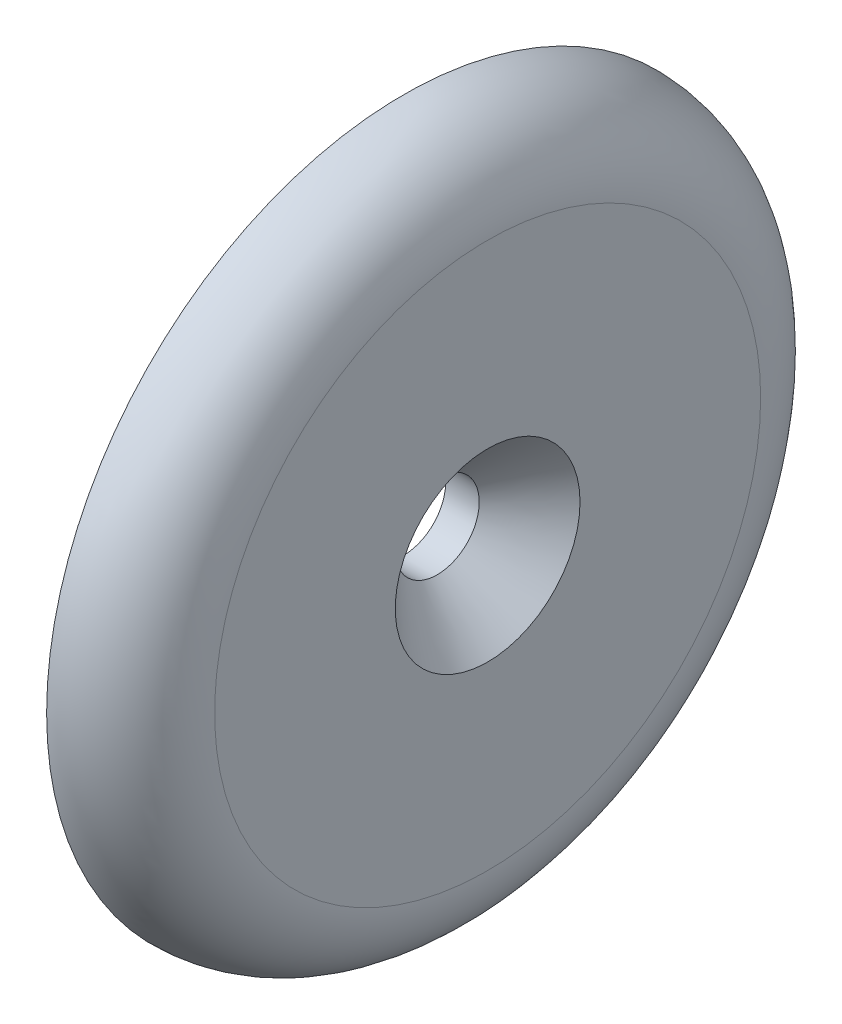
ISO-10303-21;
HEADER;
FILE_DESCRIPTION(('STEP AP214'),'2;1');
FILE_NAME('part.step','',(''),(''),'','','');
FILE_SCHEMA(('AUTOMOTIVE_DESIGN { 1 0 10303 214 1 1 1 1 }'));
ENDSEC;
DATA;
#1=APPLICATION_CONTEXT('core data for automotive mechanical design processes');
#2=APPLICATION_PROTOCOL_DEFINITION('international standard','automotive_design',2000,#1);
#3=PRODUCT_CONTEXT('',#1,'mechanical');
#4=PRODUCT('Part','Part','',(#3));
#5=PRODUCT_RELATED_PRODUCT_CATEGORY('part','',(#4));
#6=PRODUCT_DEFINITION_FORMATION('','',#4);
#7=PRODUCT_DEFINITION_CONTEXT('part definition',#1,'design');
#8=PRODUCT_DEFINITION('design','',#6,#7);
#9=PRODUCT_DEFINITION_SHAPE('','',#8);
#10=(LENGTH_UNIT() NAMED_UNIT(*) SI_UNIT(.MILLI.,.METRE.));
#11=(NAMED_UNIT(*) PLANE_ANGLE_UNIT() SI_UNIT($,.RADIAN.));
#12=(NAMED_UNIT(*) SI_UNIT($,.STERADIAN.) SOLID_ANGLE_UNIT());
#13=UNCERTAINTY_MEASURE_WITH_UNIT(LENGTH_MEASURE(1.E-05),#10,'distance_accuracy_value','');
#14=(GEOMETRIC_REPRESENTATION_CONTEXT(3) GLOBAL_UNCERTAINTY_ASSIGNED_CONTEXT((#13)) GLOBAL_UNIT_ASSIGNED_CONTEXT((#10,
#11,#12)) REPRESENTATION_CONTEXT('',''));
#15=CARTESIAN_POINT('',(0.,0.,0.));
#16=DIRECTION('',(0.,0.,1.));
#17=DIRECTION('',(1.,0.,0.));
#18=AXIS2_PLACEMENT_3D('',#15,#16,#17);
#19=CARTESIAN_POINT('',(9.99999999998398E-05,0.,0.));
#20=DIRECTION('',(1.,0.,0.));
#21=DIRECTION('',(0.,0.,-1.));
#22=AXIS2_PLACEMENT_3D('',#19,#20,#21);
#23=TOROIDAL_SURFACE('',#22,6.5001,1.9999);
#24=CARTESIAN_POINT('',(2.,0.,0.));
#25=DIRECTION('',(1.,0.,0.));
#26=DIRECTION('',(0.,0.,-1.));
#27=AXIS2_PLACEMENT_3D('',#24,#25,#26);
#28=CIRCLE('',#27,6.50009999999999);
#29=CARTESIAN_POINT('',(2.,0.,-6.50009999999999));
#30=VERTEX_POINT('',#29);
#31=EDGE_CURVE('E57',#30,#30,#28,.T.);
#32=ORIENTED_EDGE('',*,*,#31,.F.);
#33=EDGE_LOOP('',(#32));
#34=FACE_BOUND('',#33,.T.);
#35=CARTESIAN_POINT('',(9.99999999855283E-05,0.,0.));
#36=DIRECTION('',(1.,0.,0.));
#37=DIRECTION('',(0.,0.,-1.));
#38=AXIS2_PLACEMENT_3D('',#35,#36,#37);
#39=CIRCLE('',#38,8.5);
#40=CARTESIAN_POINT('',(9.99999999855283E-05,0.,-8.5));
#41=VERTEX_POINT('',#40);
#42=EDGE_CURVE('E10',#41,#41,#39,.T.);
#43=ORIENTED_EDGE('',*,*,#42,.T.);
#44=EDGE_LOOP('',(#43));
#45=FACE_BOUND('',#44,.T.);
#46=ADVANCED_FACE('F35',(#34,#45),#23,.T.);
#47=CARTESIAN_POINT('',(2.,0.,0.));
#48=DIRECTION('',(1.,0.,0.));
#49=DIRECTION('',(0.,0.,-1.));
#50=AXIS2_PLACEMENT_3D('',#47,#48,#49);
#51=CYLINDRICAL_SURFACE('',#50,8.5);
#52=ORIENTED_EDGE('',*,*,#42,.F.);
#53=EDGE_LOOP('',(#52));
#54=FACE_BOUND('',#53,.T.);
#55=CARTESIAN_POINT('',(0.,0.,0.));
#56=DIRECTION('',(1.,0.,0.));
#57=DIRECTION('',(0.,0.,-1.));
#58=AXIS2_PLACEMENT_3D('',#55,#56,#57);
#59=CIRCLE('',#58,8.5);
#60=CARTESIAN_POINT('',(0.,0.,-8.5));
#61=VERTEX_POINT('',#60);
#62=EDGE_CURVE('E41',#61,#61,#59,.T.);
#63=ORIENTED_EDGE('',*,*,#62,.T.);
#64=EDGE_LOOP('',(#63));
#65=FACE_BOUND('',#64,.T.);
#66=ADVANCED_FACE('F64',(#54,#65),#51,.T.);
#67=CARTESIAN_POINT('',(0.,0.,0.));
#68=DIRECTION('',(1.,0.,0.));
#69=DIRECTION('',(0.,0.,-1.));
#70=AXIS2_PLACEMENT_3D('',#67,#68,#69);
#71=PLANE('',#70);
#72=ORIENTED_EDGE('',*,*,#62,.F.);
#73=EDGE_LOOP('',(#72));
#74=FACE_BOUND('',#73,.T.);
#75=CARTESIAN_POINT('',(0.,0.,0.));
#76=DIRECTION('',(1.,0.,0.));
#77=DIRECTION('',(0.,0.,-1.));
#78=AXIS2_PLACEMENT_3D('',#75,#76,#77);
#79=CIRCLE('',#78,1.);
#80=CARTESIAN_POINT('',(0.,0.,-1.));
#81=VERTEX_POINT('',#80);
#82=EDGE_CURVE('E45',#81,#81,#79,.T.);
#83=ORIENTED_EDGE('',*,*,#82,.T.);
#84=EDGE_LOOP('',(#83));
#85=FACE_BOUND('',#84,.T.);
#86=ADVANCED_FACE('F68',(#74,#85),#71,.F.);
#87=CARTESIAN_POINT('',(2.,0.,0.));
#88=DIRECTION('',(1.,0.,0.));
#89=DIRECTION('',(0.,0.,-1.));
#90=AXIS2_PLACEMENT_3D('',#87,#88,#89);
#91=CYLINDRICAL_SURFACE('',#90,1.);
#92=CARTESIAN_POINT('',(0.8,0.,0.));
#93=DIRECTION('',(1.,0.,0.));
#94=DIRECTION('',(0.,0.,-1.));
#95=AXIS2_PLACEMENT_3D('',#92,#93,#94);
#96=CIRCLE('',#95,1.);
#97=CARTESIAN_POINT('',(0.8,0.,-1.));
#98=VERTEX_POINT('',#97);
#99=EDGE_CURVE('E49',#98,#98,#96,.T.);
#100=ORIENTED_EDGE('',*,*,#99,.T.);
#101=EDGE_LOOP('',(#100));
#102=FACE_BOUND('',#101,.T.);
#103=ORIENTED_EDGE('',*,*,#82,.F.);
#104=EDGE_LOOP('',(#103));
#105=FACE_BOUND('',#104,.T.);
#106=ADVANCED_FACE('F73',(#102,#105),#91,.F.);
#107=CARTESIAN_POINT('',(0.8,0.,0.));
#108=DIRECTION('',(1.,0.,0.));
#109=DIRECTION('',(0.,0.,-1.));
#110=AXIS2_PLACEMENT_3D('',#107,#108,#109);
#111=CONICAL_SURFACE('',#110,1.,0.785398163397454);
#112=CARTESIAN_POINT('',(2.,0.,0.));
#113=DIRECTION('',(1.,0.,0.));
#114=DIRECTION('',(0.,0.,-1.));
#115=AXIS2_PLACEMENT_3D('',#112,#113,#114);
#116=CIRCLE('',#115,2.20000000000001);
#117=CARTESIAN_POINT('',(2.,0.,-2.20000000000001));
#118=VERTEX_POINT('',#117);
#119=EDGE_CURVE('E54',#118,#118,#116,.T.);
#120=ORIENTED_EDGE('',*,*,#119,.T.);
#121=EDGE_LOOP('',(#120));
#122=FACE_BOUND('',#121,.T.);
#123=ORIENTED_EDGE('',*,*,#99,.F.);
#124=EDGE_LOOP('',(#123));
#125=FACE_BOUND('',#124,.T.);
#126=ADVANCED_FACE('F79',(#122,#125),#111,.F.);
#127=CARTESIAN_POINT('',(2.,0.,0.));
#128=DIRECTION('',(-1.,0.,0.));
#129=DIRECTION('',(0.,0.,1.));
#130=AXIS2_PLACEMENT_3D('',#127,#128,#129);
#131=PLANE('',#130);
#132=ORIENTED_EDGE('',*,*,#119,.F.);
#133=EDGE_LOOP('',(#132));
#134=FACE_BOUND('',#133,.T.);
#135=ORIENTED_EDGE('',*,*,#31,.T.);
#136=EDGE_LOOP('',(#135));
#137=FACE_BOUND('',#136,.T.);
#138=ADVANCED_FACE('F61',(#134,#137),#131,.F.);
#139=CLOSED_SHELL('',(#46,#66,#86,#106,#126,#138));
#140=MANIFOLD_SOLID_BREP('B2',#139);
#141=ADVANCED_BREP_SHAPE_REPRESENTATION('',(#18,#140),#14);
#142=SHAPE_DEFINITION_REPRESENTATION(#9,#141);
ENDSEC;
END-ISO-10303-21;
